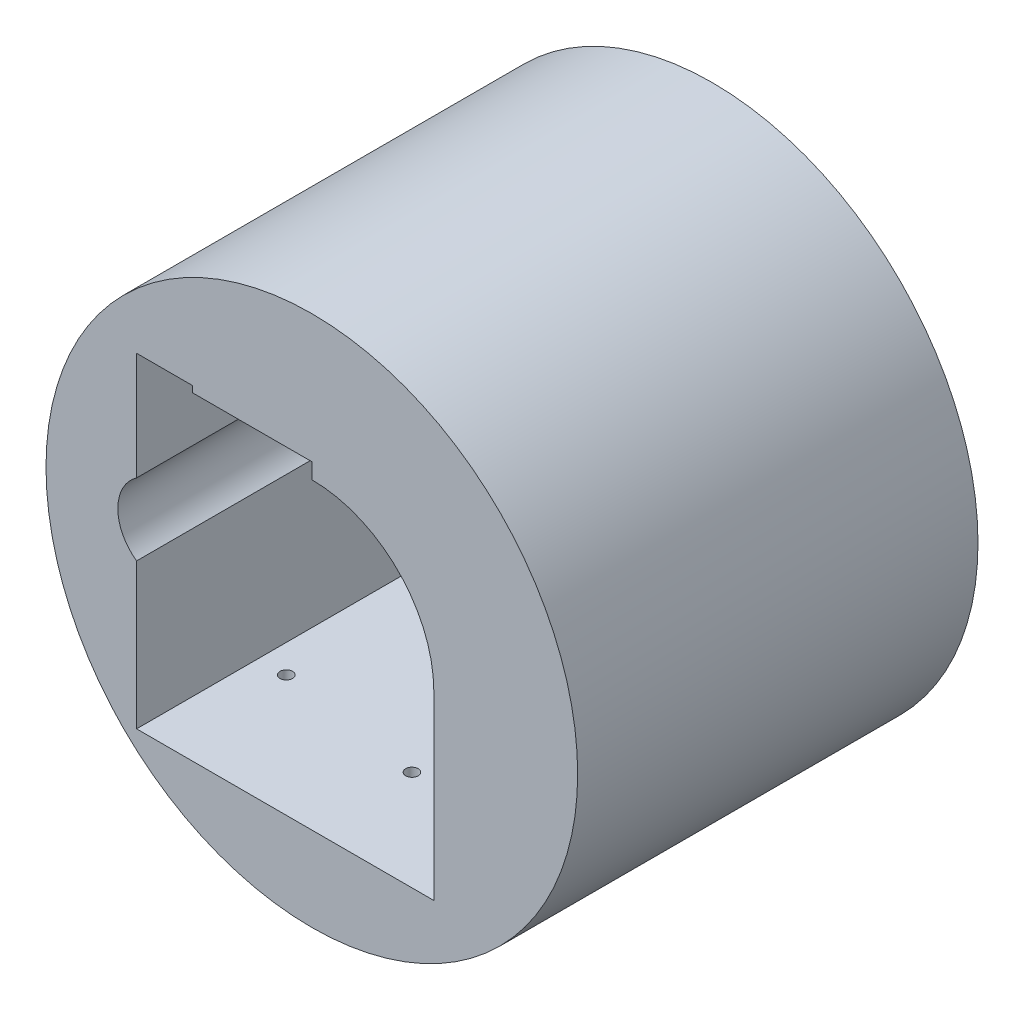
ISO-10303-21;
HEADER;
FILE_DESCRIPTION(('STEP AP214'),'2;1');
FILE_NAME('part.step','',(''),(''),'','','');
FILE_SCHEMA(('AUTOMOTIVE_DESIGN { 1 0 10303 214 1 1 1 1 }'));
ENDSEC;
DATA;
#1=APPLICATION_CONTEXT('core data for automotive mechanical design processes');
#2=APPLICATION_PROTOCOL_DEFINITION('international standard','automotive_design',2000,#1);
#3=PRODUCT_CONTEXT('',#1,'mechanical');
#4=PRODUCT('Part','Part','',(#3));
#5=PRODUCT_RELATED_PRODUCT_CATEGORY('part','',(#4));
#6=PRODUCT_DEFINITION_FORMATION('','',#4);
#7=PRODUCT_DEFINITION_CONTEXT('part definition',#1,'design');
#8=PRODUCT_DEFINITION('design','',#6,#7);
#9=PRODUCT_DEFINITION_SHAPE('','',#8);
#10=(LENGTH_UNIT() NAMED_UNIT(*) SI_UNIT(.MILLI.,.METRE.));
#11=(NAMED_UNIT(*) PLANE_ANGLE_UNIT() SI_UNIT($,.RADIAN.));
#12=(NAMED_UNIT(*) SI_UNIT($,.STERADIAN.) SOLID_ANGLE_UNIT());
#13=UNCERTAINTY_MEASURE_WITH_UNIT(LENGTH_MEASURE(1.E-05),#10,'distance_accuracy_value','');
#14=(GEOMETRIC_REPRESENTATION_CONTEXT(3) GLOBAL_UNCERTAINTY_ASSIGNED_CONTEXT((#13)) GLOBAL_UNIT_ASSIGNED_CONTEXT((#10,
#11,#12)) REPRESENTATION_CONTEXT('',''));
#15=CARTESIAN_POINT('',(0.,0.,0.));
#16=DIRECTION('',(0.,0.,1.));
#17=DIRECTION('',(1.,0.,0.));
#18=AXIS2_PLACEMENT_3D('',#15,#16,#17);
#19=CARTESIAN_POINT('',(18.3011411056539,-1.1715728752538,-4.55781586355207));
#20=DIRECTION('',(0.,-1.,0.));
#21=DIRECTION('',(0.,0.,-1.));
#22=AXIS2_PLACEMENT_3D('',#19,#20,#21);
#23=CYLINDRICAL_SURFACE('',#22,1.);
#24=CARTESIAN_POINT('',(18.3011411056539,-3.99999999999999,-4.55781586355207));
#25=DIRECTION('',(0.,-1.,0.));
#26=DIRECTION('',(0.,0.,-1.));
#27=AXIS2_PLACEMENT_3D('',#24,#25,#26);
#28=CIRCLE('',#27,1.);
#29=CARTESIAN_POINT('',(18.3011411056539,-3.99999999999999,-5.55781586355208));
#30=VERTEX_POINT('',#29);
#31=EDGE_CURVE('E165',#30,#30,#28,.F.);
#32=ORIENTED_EDGE('',*,*,#31,.T.);
#33=EDGE_LOOP('',(#32));
#34=FACE_BOUND('',#33,.T.);
#35=CARTESIAN_POINT('',(18.3011411056539,-5.49999999999673,-4.55781586355207));
#36=DIRECTION('',(0.,-1.,0.));
#37=DIRECTION('',(0.,0.,-1.));
#38=AXIS2_PLACEMENT_3D('',#35,#36,#37);
#39=CIRCLE('',#38,1.);
#40=CARTESIAN_POINT('',(18.3011411056539,-5.49999999999673,-5.55781586355208));
#41=VERTEX_POINT('',#40);
#42=EDGE_CURVE('E477',#41,#41,#39,.F.);
#43=ORIENTED_EDGE('',*,*,#42,.F.);
#44=EDGE_LOOP('',(#43));
#45=FACE_BOUND('',#44,.T.);
#46=ADVANCED_FACE('F33',(#34,#45),#23,.F.);
#47=CARTESIAN_POINT('',(18.3011411056539,-1.1715728752538,-32.5578158635521));
#48=DIRECTION('',(0.,-1.,0.));
#49=DIRECTION('',(0.,0.,-1.));
#50=AXIS2_PLACEMENT_3D('',#47,#48,#49);
#51=CYLINDRICAL_SURFACE('',#50,1.);
#52=CARTESIAN_POINT('',(18.3011411056539,-4.,-32.5578158635521));
#53=DIRECTION('',(0.,-1.,0.));
#54=DIRECTION('',(0.,0.,-1.));
#55=AXIS2_PLACEMENT_3D('',#52,#53,#54);
#56=CIRCLE('',#55,1.);
#57=CARTESIAN_POINT('',(18.3011411056539,-4.,-33.5578158635521));
#58=VERTEX_POINT('',#57);
#59=EDGE_CURVE('E162',#58,#58,#56,.F.);
#60=ORIENTED_EDGE('',*,*,#59,.T.);
#61=EDGE_LOOP('',(#60));
#62=FACE_BOUND('',#61,.T.);
#63=CARTESIAN_POINT('',(18.3011411056539,-5.49999999999673,-32.5578158635521));
#64=DIRECTION('',(0.,-1.,0.));
#65=DIRECTION('',(0.,0.,-1.));
#66=AXIS2_PLACEMENT_3D('',#63,#64,#65);
#67=CIRCLE('',#66,1.);
#68=CARTESIAN_POINT('',(18.3011411056539,-5.49999999999673,-33.5578158635521));
#69=VERTEX_POINT('',#68);
#70=EDGE_CURVE('E155',#69,#69,#67,.F.);
#71=ORIENTED_EDGE('',*,*,#70,.F.);
#72=EDGE_LOOP('',(#71));
#73=FACE_BOUND('',#72,.T.);
#74=ADVANCED_FACE('F241',(#62,#73),#51,.F.);
#75=CARTESIAN_POINT('',(41.8161335126856,-1.1715728752538,-1.12874839913922));
#76=DIRECTION('',(0.,-1.,0.));
#77=DIRECTION('',(0.,0.,-1.));
#78=AXIS2_PLACEMENT_3D('',#75,#76,#77);
#79=CYLINDRICAL_SURFACE('',#78,0.999999999999998);
#80=CARTESIAN_POINT('',(41.8161335126856,-3.99999999999999,-1.12874839913922));
#81=DIRECTION('',(0.,-1.,0.));
#82=DIRECTION('',(0.,0.,-1.));
#83=AXIS2_PLACEMENT_3D('',#80,#81,#82);
#84=CIRCLE('',#83,0.999999999999998);
#85=CARTESIAN_POINT('',(41.8161335126856,-3.99999999999999,-2.12874839913922));
#86=VERTEX_POINT('',#85);
#87=EDGE_CURVE('E166',#86,#86,#84,.F.);
#88=ORIENTED_EDGE('',*,*,#87,.T.);
#89=EDGE_LOOP('',(#88));
#90=FACE_BOUND('',#89,.T.);
#91=CARTESIAN_POINT('',(41.8161335126856,-12.4999999999967,-1.12874839913922));
#92=DIRECTION('',(0.,-1.,0.));
#93=DIRECTION('',(0.,0.,-1.));
#94=AXIS2_PLACEMENT_3D('',#91,#92,#93);
#95=CIRCLE('',#94,0.999999999999998);
#96=CARTESIAN_POINT('',(41.8161335126856,-12.4999999999967,-2.12874839913922));
#97=VERTEX_POINT('',#96);
#98=EDGE_CURVE('E161',#97,#97,#95,.F.);
#99=ORIENTED_EDGE('',*,*,#98,.F.);
#100=EDGE_LOOP('',(#99));
#101=FACE_BOUND('',#100,.T.);
#102=ADVANCED_FACE('F244',(#90,#101),#79,.F.);
#103=CARTESIAN_POINT('',(41.8161335126836,25.0000000000033,14.8712516008608));
#104=DIRECTION('',(0.,0.,-1.));
#105=DIRECTION('',(0.,1.,0.));
#106=AXIS2_PLACEMENT_3D('',#103,#104,#105);
#107=CYLINDRICAL_SURFACE('',#106,42.5);
#108=CARTESIAN_POINT('',(18.3011411056539,-10.4019085939883,-6.80781586355207));
#109=CARTESIAN_POINT('',(18.4605756897232,-10.5078069288308,-6.80781220830151));
#110=CARTESIAN_POINT('',(18.6210371329044,-10.6128214602459,-6.7908556810594));
#111=CARTESIAN_POINT('',(18.9382937431222,-10.8174561170813,-6.72182710057122));
#112=CARTESIAN_POINT('',(19.0950812110119,-10.9170654055825,-6.66968712876438));
#113=CARTESIAN_POINT('',(19.3621471241321,-11.0844456955812,-6.54603338011057));
#114=CARTESIAN_POINT('',(19.4746656871843,-11.1541807192807,-6.4820015275212));
#115=CARTESIAN_POINT('',(19.6897443591742,-11.2862064677296,-6.33302217933153));
#116=CARTESIAN_POINT('',(19.7923153781341,-11.3485053658054,-6.24809796764978));
#117=CARTESIAN_POINT('',(19.9840759330033,-11.4640084381692,-6.05736641909167));
#118=CARTESIAN_POINT('',(20.0731569975852,-11.5171393245457,-5.95140416495323));
#119=CARTESIAN_POINT('',(20.2321048978198,-11.6113135962962,-5.72116744144282));
#120=CARTESIAN_POINT('',(20.3019861918808,-11.6523660789854,-5.59690686056061));
#121=CARTESIAN_POINT('',(20.4099818389848,-11.715528869455,-5.35198855039096));
#122=CARTESIAN_POINT('',(20.4511206765045,-11.7394539982696,-5.23313137809204));
#123=CARTESIAN_POINT('',(20.5131175294567,-11.7754378044941,-4.98854735177319));
#124=CARTESIAN_POINT('',(20.5339935806353,-11.7875070348614,-4.86282671236489));
#125=CARTESIAN_POINT('',(20.5530297640251,-11.7985123298085,-4.62333607196803));
#126=CARTESIAN_POINT('',(20.5534679028538,-11.7987654223653,-4.50980077695234));
#127=CARTESIAN_POINT('',(20.5373182659976,-11.7894293279362,-4.28437764352726));
#128=CARTESIAN_POINT('',(20.5207345833194,-11.7798425070209,-4.17248941563055));
#129=CARTESIAN_POINT('',(20.4720875945635,-11.7516320102377,-3.95664966032859));
#130=CARTESIAN_POINT('',(20.4404631857588,-11.7332644866352,-3.8525644168585));
#131=CARTESIAN_POINT('',(20.3633758627356,-11.6882974488643,-3.65157106581906));
#132=CARTESIAN_POINT('',(20.3179109095621,-11.6616967217909,-3.5546640183409));
#133=CARTESIAN_POINT('',(20.2122467330221,-11.5995356940574,-3.36510203923708));
#134=CARTESIAN_POINT('',(20.1513948739883,-11.5635756101614,-3.27294384779255));
#135=CARTESIAN_POINT('',(20.0187136753197,-11.4846329962385,-3.10031386531784));
#136=CARTESIAN_POINT('',(19.9468802422592,-11.4416478471762,-3.01984645397763));
#137=CARTESIAN_POINT('',(19.7859815401766,-11.3446304857722,-2.86319917536076));
#138=CARTESIAN_POINT('',(19.6958872449045,-11.2899000343261,-2.78851164050748));
#139=CARTESIAN_POINT('',(19.5078603950721,-11.1746200099008,-2.65528435466808));
#140=CARTESIAN_POINT('',(19.4099238726314,-11.1140674880165,-2.59675284549644));
#141=CARTESIAN_POINT('',(19.1941969202485,-10.9793880382003,-2.48863013463941));
#142=CARTESIAN_POINT('',(19.0755823436275,-10.9045638692927,-2.44155235968801));
#143=CARTESIAN_POINT('',(18.8346302184091,-10.7508178943699,-2.36834850983783));
#144=CARTESIAN_POINT('',(18.712290829184,-10.6718940484253,-2.34223297380467));
#145=CARTESIAN_POINT('',(18.4494080733579,-10.500338632118,-2.30827266296366));
#146=CARTESIAN_POINT('',(18.3087092705993,-10.4073324156304,-2.3034901033834));
#147=CARTESIAN_POINT('',(18.0294056815479,-10.2203050909705,-2.31990212727429));
#148=CARTESIAN_POINT('',(17.8908028031475,-10.1262831776893,-2.34111908774265));
#149=CARTESIAN_POINT('',(17.6078487445364,-9.9319443037692,-2.41192944706449));
#150=CARTESIAN_POINT('',(17.4639572328008,-9.83174284946365,-2.46370567736356));
#151=CARTESIAN_POINT('',(17.1869032333797,-9.63639237511369,-2.5970582066671));
#152=CARTESIAN_POINT('',(17.0537323471767,-9.54123942040729,-2.67861089604462));
#153=CARTESIAN_POINT('',(16.8320934441719,-9.38112840781303,-2.84924012722681));
#154=CARTESIAN_POINT('',(16.7403756938218,-9.31424859958704,-2.93230707363389));
#155=CARTESIAN_POINT('',(16.569487421053,-9.18871239318988,-3.11575613536224));
#156=CARTESIAN_POINT('',(16.4902992995643,-9.13004447424469,-3.21611354286206));
#157=CARTESIAN_POINT('',(16.360589630629,-9.03337580658109,-3.41404781696955));
#158=CARTESIAN_POINT('',(16.3074763778957,-8.99355498327169,-3.50903121619044));
#159=CARTESIAN_POINT('',(16.2146126733032,-8.92367189945809,-3.70870067237782));
#160=CARTESIAN_POINT('',(16.1748560469611,-8.89360513008472,-3.81338221746706));
#161=CARTESIAN_POINT('',(16.110786157732,-8.84504056011061,-4.03078599994615));
#162=CARTESIAN_POINT('',(16.0865760933446,-8.82662008008442,-4.14355655426096));
#163=CARTESIAN_POINT('',(16.0557834493203,-8.80317680998289,-4.37283413412612));
#164=CARTESIAN_POINT('',(16.04918959552,-8.7981454510388,-4.48933872159499));
#165=CARTESIAN_POINT('',(16.0538255120867,-8.80167853261571,-4.70852745465439));
#166=CARTESIAN_POINT('',(16.063123889897,-8.80876973384415,-4.81128449793671));
#167=CARTESIAN_POINT('',(16.0953615233085,-8.83330154280663,-5.01333948404408));
#168=CARTESIAN_POINT('',(16.1183009213851,-8.85074225863759,-5.11263739072824));
#169=CARTESIAN_POINT('',(16.176556333294,-8.8948875489511,-5.30533463351144));
#170=CARTESIAN_POINT('',(16.2118757435383,-8.92159466561709,-5.3987323426051));
#171=CARTESIAN_POINT('',(16.2932606807871,-8.98287143567977,-5.5779196444827));
#172=CARTESIAN_POINT('',(16.339330009213,-9.01744387032746,-5.66370653105662));
#173=CARTESIAN_POINT('',(16.4470821710994,-9.09789293157709,-5.83714831436912));
#174=CARTESIAN_POINT('',(16.510013026032,-9.14465281096455,-5.92361377668957));
#175=CARTESIAN_POINT('',(16.6452258776938,-9.24445181846824,-6.08474891792535));
#176=CARTESIAN_POINT('',(16.7175123427331,-9.29749394599945,-6.15941292228042));
#177=CARTESIAN_POINT('',(16.8841897193127,-9.41890064557258,-6.30985941392261));
#178=CARTESIAN_POINT('',(16.9801585514822,-9.48825056452142,-6.38309760057786));
#179=CARTESIAN_POINT('',(17.1801595322881,-9.63140125762806,-6.51232396802367));
#180=CARTESIAN_POINT('',(17.2842016820515,-9.7052075263238,-6.56829031155798));
#181=CARTESIAN_POINT('',(17.5180075596621,-9.86940018043223,-6.67168521200516));
#182=CARTESIAN_POINT('',(17.648957060931,-9.96031790548546,-6.71559179619434));
#183=CARTESIAN_POINT('',(17.9156521961799,-10.143178990135,-6.7787652038681));
#184=CARTESIAN_POINT('',(18.0513873532905,-10.2351198403064,-6.79808278748166));
#185=CARTESIAN_POINT('',(18.2255944987443,-10.351641617088,-6.80686455582957));
#186=CARTESIAN_POINT('',(18.2633389386859,-10.3767999479646,-6.80781673021719));
#187=CARTESIAN_POINT('',(18.3011411056539,-10.4019085939883,-6.80781586355207));
#188=B_SPLINE_CURVE_WITH_KNOTS('',3,(#108,#109,#110,#111,#112,#113,#114,#115,#116,#117,#118,
#119,#120,#121,#122,#123,#124,#125,#126,#127,#128,#129,#130,#131,#132,#133,#134,#135,#136,#137,
#138,#139,#140,#141,#142,#143,#144,#145,#146,#147,#148,#149,#150,#151,#152,#153,#154,#155,#156,
#157,#158,#159,#160,#161,#162,#163,#164,#165,#166,#167,#168,#169,#170,#171,#172,#173,#174,#175,
#176,#177,#178,#179,#180,#181,#182,#183,#184,#185,#186,#187),.UNSPECIFIED.,.T.,.F.,(4,2,2,2,2,2,
2,2,2,2,2,2,2,2,2,2,2,2,2,2,2,2,2,2,2,2,2,2,2,2,2,2,2,2,2,2,2,2,2,4),(0.,0.574052362161319,
1.14921606442613,1.58856636672258,2.0274292267574,2.46965233083123,2.91154149981678,
3.29344769929199,3.6750136544939,4.01393529952513,4.35277546775038,4.6822837602136,
5.01184061853809,5.35884506284503,5.70597917126234,6.09203497644143,6.4782873611793,
6.9203442482344,7.36262324253802,7.866690631641,8.37119216110588,8.91703498191525,
9.46244594282981,9.8828371697841,10.3026325721155,10.6488779596504,10.9949630643858,
11.34332237119,11.6914586787505,12.00022318568,12.3089909175999,12.6178434252272,
12.9268053162495,13.2756663839667,13.6246946895073,14.0408204318046,14.457470157811,
14.9515845510078,15.4446772595659,15.580785892266),.UNSPECIFIED.);
#189=CARTESIAN_POINT('',(18.3011411056539,-10.4019085939883,-6.80781586355207));
#190=VERTEX_POINT('',#189);
#191=EDGE_CURVE('E38',#190,#190,#188,.T.);
#192=ORIENTED_EDGE('',*,*,#191,.F.);
#193=EDGE_LOOP('',(#192));
#194=FACE_BOUND('',#193,.T.);
#195=CARTESIAN_POINT('',(18.3011411056539,-10.4019085939883,-34.8078158635521));
#196=CARTESIAN_POINT('',(18.4605756897232,-10.5078069288308,-34.8078122083015));
#197=CARTESIAN_POINT('',(18.6210371329044,-10.6128214602459,-34.7908556810594));
#198=CARTESIAN_POINT('',(18.9382937431222,-10.8174561170813,-34.7218271005712));
#199=CARTESIAN_POINT('',(19.0950812110119,-10.9170654055825,-34.6696871287644));
#200=CARTESIAN_POINT('',(19.3621471241321,-11.0844456955813,-34.5460333801106));
#201=CARTESIAN_POINT('',(19.4746656871843,-11.1541807192807,-34.4820015275212));
#202=CARTESIAN_POINT('',(19.6897443591742,-11.2862064677296,-34.3330221793315));
#203=CARTESIAN_POINT('',(19.7923153781341,-11.3485053658054,-34.2480979676498));
#204=CARTESIAN_POINT('',(19.9840759330033,-11.4640084381692,-34.0573664190917));
#205=CARTESIAN_POINT('',(20.0731569975852,-11.5171393245457,-33.9514041649532));
#206=CARTESIAN_POINT('',(20.2321048978198,-11.6113135962962,-33.7211674414428));
#207=CARTESIAN_POINT('',(20.3019861918808,-11.6523660789854,-33.5969068605606));
#208=CARTESIAN_POINT('',(20.4099818389848,-11.715528869455,-33.351988550391));
#209=CARTESIAN_POINT('',(20.4511206765045,-11.7394539982696,-33.233131378092));
#210=CARTESIAN_POINT('',(20.5131175294567,-11.7754378044942,-32.9885473517732));
#211=CARTESIAN_POINT('',(20.5339935806353,-11.7875070348614,-32.8628267123649));
#212=CARTESIAN_POINT('',(20.5530297640251,-11.7985123298085,-32.623336071968));
#213=CARTESIAN_POINT('',(20.5534679028538,-11.7987654223653,-32.5098007769523));
#214=CARTESIAN_POINT('',(20.5373182659976,-11.7894293279362,-32.2843776435273));
#215=CARTESIAN_POINT('',(20.5207345833194,-11.7798425070209,-32.1724894156306));
#216=CARTESIAN_POINT('',(20.4720875945635,-11.7516320102377,-31.9566496603286));
#217=CARTESIAN_POINT('',(20.4404631857588,-11.7332644866352,-31.8525644168585));
#218=CARTESIAN_POINT('',(20.3633758627356,-11.6882974488643,-31.6515710658191));
#219=CARTESIAN_POINT('',(20.3179109095621,-11.6616967217909,-31.5546640183409));
#220=CARTESIAN_POINT('',(20.2122467330221,-11.5995356940574,-31.3651020392371));
#221=CARTESIAN_POINT('',(20.1513948739883,-11.5635756101614,-31.2729438477926));
#222=CARTESIAN_POINT('',(20.0187136753197,-11.4846329962385,-31.1003138653178));
#223=CARTESIAN_POINT('',(19.9468802422592,-11.4416478471762,-31.0198464539776));
#224=CARTESIAN_POINT('',(19.7859815401766,-11.3446304857722,-30.8631991753608));
#225=CARTESIAN_POINT('',(19.6958872449045,-11.2899000343261,-30.7885116405075));
#226=CARTESIAN_POINT('',(19.5078603950721,-11.1746200099009,-30.6552843546681));
#227=CARTESIAN_POINT('',(19.4099238726314,-11.1140674880166,-30.5967528454964));
#228=CARTESIAN_POINT('',(19.1941969202485,-10.9793880382003,-30.4886301346394));
#229=CARTESIAN_POINT('',(19.0755823436275,-10.9045638692927,-30.441552359688));
#230=CARTESIAN_POINT('',(18.8346302184091,-10.7508178943699,-30.3683485098378));
#231=CARTESIAN_POINT('',(18.712290829184,-10.6718940484253,-30.3422329738047));
#232=CARTESIAN_POINT('',(18.4494080733579,-10.500338632118,-30.3082726629637));
#233=CARTESIAN_POINT('',(18.3087092705993,-10.4073324156304,-30.3034901033834));
#234=CARTESIAN_POINT('',(18.0294056815479,-10.2203050909705,-30.3199021272743));
#235=CARTESIAN_POINT('',(17.8908028031475,-10.1262831776893,-30.3411190877427));
#236=CARTESIAN_POINT('',(17.6078487445364,-9.9319443037692,-30.4119294470645));
#237=CARTESIAN_POINT('',(17.4639572328008,-9.83174284946365,-30.4637056773636));
#238=CARTESIAN_POINT('',(17.1869032333797,-9.63639237511369,-30.5970582066671));
#239=CARTESIAN_POINT('',(17.0537323471767,-9.54123942040729,-30.6786108960446));
#240=CARTESIAN_POINT('',(16.8320934441719,-9.38112840781303,-30.8492401272268));
#241=CARTESIAN_POINT('',(16.7403756938218,-9.31424859958704,-30.9323070736339));
#242=CARTESIAN_POINT('',(16.569487421053,-9.18871239318988,-31.1157561353623));
#243=CARTESIAN_POINT('',(16.4902992995643,-9.13004447424469,-31.2161135428621));
#244=CARTESIAN_POINT('',(16.360589630629,-9.03337580658109,-31.4140478169696));
#245=CARTESIAN_POINT('',(16.3074763778956,-8.99355498327169,-31.5090312161905));
#246=CARTESIAN_POINT('',(16.2146126733032,-8.92367189945809,-31.7087006723778));
#247=CARTESIAN_POINT('',(16.1748560469611,-8.89360513008472,-31.8133822174671));
#248=CARTESIAN_POINT('',(16.110786157732,-8.8450405601106,-32.0307859999462));
#249=CARTESIAN_POINT('',(16.0865760933445,-8.82662008008441,-32.143556554261));
#250=CARTESIAN_POINT('',(16.0557834493203,-8.80317680998289,-32.3728341341261));
#251=CARTESIAN_POINT('',(16.04918959552,-8.79814545103881,-32.489338721595));
#252=CARTESIAN_POINT('',(16.0538255120867,-8.80167853261572,-32.7085274546544));
#253=CARTESIAN_POINT('',(16.063123889897,-8.80876973384416,-32.8112844979367));
#254=CARTESIAN_POINT('',(16.0953615233085,-8.83330154280663,-33.0133394840441));
#255=CARTESIAN_POINT('',(16.1183009213851,-8.8507422586376,-33.1126373907282));
#256=CARTESIAN_POINT('',(16.176556333294,-8.89488754895111,-33.3053346335114));
#257=CARTESIAN_POINT('',(16.2118757435383,-8.9215946656171,-33.3987323426051));
#258=CARTESIAN_POINT('',(16.2932606807871,-8.98287143567977,-33.5779196444827));
#259=CARTESIAN_POINT('',(16.339330009213,-9.01744387032747,-33.6637065310566));
#260=CARTESIAN_POINT('',(16.4470821710994,-9.09789293157711,-33.8371483143691));
#261=CARTESIAN_POINT('',(16.510013026032,-9.14465281096455,-33.9236137766896));
#262=CARTESIAN_POINT('',(16.6452258776938,-9.24445181846824,-34.0847489179254));
#263=CARTESIAN_POINT('',(16.7175123427331,-9.29749394599945,-34.1594129222804));
#264=CARTESIAN_POINT('',(16.8841897193127,-9.41890064557258,-34.3098594139226));
#265=CARTESIAN_POINT('',(16.9801585514822,-9.48825056452143,-34.3830976005779));
#266=CARTESIAN_POINT('',(17.1801595322881,-9.63140125762807,-34.5123239680237));
#267=CARTESIAN_POINT('',(17.2842016820515,-9.7052075263238,-34.568290311558));
#268=CARTESIAN_POINT('',(17.5180075596622,-9.86940018043223,-34.6716852120052));
#269=CARTESIAN_POINT('',(17.648957060931,-9.96031790548547,-34.7155917961944));
#270=CARTESIAN_POINT('',(17.9156521961799,-10.143178990135,-34.7787652038681));
#271=CARTESIAN_POINT('',(18.0513873532905,-10.2351198403064,-34.7980827874817));
#272=CARTESIAN_POINT('',(18.2255944987443,-10.351641617088,-34.8068645558296));
#273=CARTESIAN_POINT('',(18.2633389386859,-10.3767999479646,-34.8078167302172));
#274=CARTESIAN_POINT('',(18.3011411056539,-10.4019085939883,-34.8078158635521));
#275=B_SPLINE_CURVE_WITH_KNOTS('',3,(#195,#196,#197,#198,#199,#200,#201,#202,#203,#204,#205,
#206,#207,#208,#209,#210,#211,#212,#213,#214,#215,#216,#217,#218,#219,#220,#221,#222,#223,#224,
#225,#226,#227,#228,#229,#230,#231,#232,#233,#234,#235,#236,#237,#238,#239,#240,#241,#242,#243,
#244,#245,#246,#247,#248,#249,#250,#251,#252,#253,#254,#255,#256,#257,#258,#259,#260,#261,#262,
#263,#264,#265,#266,#267,#268,#269,#270,#271,#272,#273,#274),.UNSPECIFIED.,.T.,.F.,(4,2,2,2,2,2,
2,2,2,2,2,2,2,2,2,2,2,2,2,2,2,2,2,2,2,2,2,2,2,2,2,2,2,2,2,2,2,2,2,4),(0.,0.574052362161317,
1.14921606442613,1.58856636672259,2.02742922675741,2.46965233083124,2.91154149981679,
3.293447699292,3.6750136544939,4.01393529952514,4.3527754677504,4.68228376021363,
5.01184061853811,5.35884506284505,5.70597917126236,6.09203497644144,6.47828736117932,
6.92034424823443,7.36262324253804,7.86669063164103,8.37119216110591,8.91703498191528,
9.46244594282984,9.88283716978413,10.3026325721155,10.6488779596504,10.9949630643858,
11.3433223711901,11.6914586787506,12.00022318568,12.3089909175999,12.6178434252272,
12.9268053162495,13.2756663839668,13.6246946895074,14.0408204318046,14.457470157811,
14.9515845510079,15.4446772595659,15.5807858922661),.UNSPECIFIED.);
#276=CARTESIAN_POINT('',(18.3011411056539,-10.4019085939883,-34.8078158635521));
#277=VERTEX_POINT('',#276);
#278=EDGE_CURVE('E302',#277,#277,#275,.T.);
#279=ORIENTED_EDGE('',*,*,#278,.F.);
#280=EDGE_LOOP('',(#279));
#281=FACE_BOUND('',#280,.T.);
#282=CARTESIAN_POINT('',(41.8161335126836,-17.4999999999967,-3.37874839913922));
#283=CARTESIAN_POINT('',(41.9424220888927,-17.4999992042486,-3.37874282915832));
#284=CARTESIAN_POINT('',(42.068799981149,-17.499431074244,-3.36808014842739));
#285=CARTESIAN_POINT('',(42.3180687451767,-17.4972193090463,-3.32569620991315));
#286=CARTESIAN_POINT('',(42.4409553420096,-17.4955744100082,-3.29395020518664));
#287=CARTESIAN_POINT('',(42.6795945906514,-17.49139526175,-3.21031171483013));
#288=CARTESIAN_POINT('',(42.7953508703286,-17.4888614692622,-3.15842957412344));
#289=CARTESIAN_POINT('',(43.0164803642576,-17.4831898173157,-3.03600764248508));
#290=CARTESIAN_POINT('',(43.1218560058386,-17.4800520995834,-2.96547222757409));
#291=CARTESIAN_POINT('',(43.3193816437007,-17.473521598497,-2.80765880168756));
#292=CARTESIAN_POINT('',(43.4115186068705,-17.4701285687335,-2.72036448683642));
#293=CARTESIAN_POINT('',(43.5798402864828,-17.4634719780592,-2.5315440771329));
#294=CARTESIAN_POINT('',(43.6560243481079,-17.4602084224674,-2.43001739837129));
#295=CARTESIAN_POINT('',(43.7903147694006,-17.4541770142549,-2.21554432383161));
#296=CARTESIAN_POINT('',(43.8484107681249,-17.4514094461223,-2.10259143194897));
#297=CARTESIAN_POINT('',(43.9448095122216,-17.4466851616327,-1.86851792753297));
#298=CARTESIAN_POINT('',(43.9831124212553,-17.4447284385712,-1.74739738254413));
#299=CARTESIAN_POINT('',(44.0388027804166,-17.4418487622563,-1.50054825473719));
#300=CARTESIAN_POINT('',(44.056209993068,-17.4409248322752,-1.37482414201688));
#301=CARTESIAN_POINT('',(44.0696758150133,-17.4402120018956,-1.12223524866468));
#302=CARTESIAN_POINT('',(44.0657346085532,-17.4404230917014,-0.995370477886593));
#303=CARTESIAN_POINT('',(44.0366319146825,-17.4419555889636,-0.744235892839721));
#304=CARTESIAN_POINT('',(44.0114917864937,-17.4432758788275,-0.619963595595412));
#305=CARTESIAN_POINT('',(43.9407379917633,-17.4468762110066,-0.377405505312395));
#306=CARTESIAN_POINT('',(43.8951242309023,-17.4491562577433,-0.259119739855683));
#307=CARTESIAN_POINT('',(43.7846936159658,-17.4544204179865,-0.0318236389575769));
#308=CARTESIAN_POINT('',(43.719867034478,-17.4574048879849,0.0771819618813105));
#309=CARTESIAN_POINT('',(43.5728580442851,-17.463741164417,0.282771686240818));
#310=CARTESIAN_POINT('',(43.4906754974438,-17.4670929737743,0.379355710888307));
#311=CARTESIAN_POINT('',(43.3111669544483,-17.4737911255746,0.557484924372756));
#312=CARTESIAN_POINT('',(43.2138224644393,-17.4771374562299,0.639011477758691));
#313=CARTESIAN_POINT('',(43.0068182476987,-17.4834435308626,0.784567878792195));
#314=CARTESIAN_POINT('',(42.8971585176927,-17.4864032747373,0.848597721787619));
#315=CARTESIAN_POINT('',(42.6686256693997,-17.4916027702576,0.957341388784478));
#316=CARTESIAN_POINT('',(42.5497522353965,-17.4938424972176,1.00205455053627));
#317=CARTESIAN_POINT('',(42.3061712403794,-17.4973491928175,1.07088337432662));
#318=CARTESIAN_POINT('',(42.181463728314,-17.4986161696173,1.09499920914593));
#319=CARTESIAN_POINT('',(41.929916325495,-17.5000335298768,1.12192582441762));
#320=CARTESIAN_POINT('',(41.8030792009474,-17.5001852641346,1.12476237873242));
#321=CARTESIAN_POINT('',(41.5507308126412,-17.4993586269449,1.10911719249881));
#322=CARTESIAN_POINT('',(41.4252195439587,-17.4983802596957,1.09063553114781));
#323=CARTESIAN_POINT('',(41.1791579761622,-17.4954044728283,1.03289987427651));
#324=CARTESIAN_POINT('',(41.0586049052942,-17.4934076311654,0.993657659309481));
#325=CARTESIAN_POINT('',(40.8257963730031,-17.4886196765712,0.895526785310962));
#326=CARTESIAN_POINT('',(40.7135409651708,-17.4858285585108,0.836637999404876));
#327=CARTESIAN_POINT('',(40.5003960011277,-17.4797625932495,0.700819713255916));
#328=CARTESIAN_POINT('',(40.3995174587582,-17.4764872842755,0.62387294948548));
#329=CARTESIAN_POINT('',(40.212100566677,-17.4698232867481,0.454148145935562));
#330=CARTESIAN_POINT('',(40.1255623195219,-17.4664345973842,0.361369992945353));
#331=CARTESIAN_POINT('',(39.9691956328318,-17.4599219098898,0.162505095752567));
#332=CARTESIAN_POINT('',(39.8993838788221,-17.4567981780573,0.0564052218843718));
#333=CARTESIAN_POINT('',(39.7785659363644,-17.4511718566729,-0.166025068091379));
#334=CARTESIAN_POINT('',(39.72755965868,-17.4486692641734,-0.282355435649636));
#335=CARTESIAN_POINT('',(39.6458296009704,-17.4445693368099,-0.521882892448666));
#336=CARTESIAN_POINT('',(39.615095213134,-17.4429715285551,-0.645076353732022));
#337=CARTESIAN_POINT('',(39.5747466879876,-17.4408600239868,-0.894883675147225));
#338=CARTESIAN_POINT('',(39.5651324115073,-17.4403463205295,-1.02149751273505));
#339=CARTESIAN_POINT('',(39.5672983361126,-17.4404611301174,-1.27438544326094));
#340=CARTESIAN_POINT('',(39.579052292594,-17.4410882420062,-1.40065976245581));
#341=CARTESIAN_POINT('',(39.6235667446075,-17.4434110421477,-1.64943952188014));
#342=CARTESIAN_POINT('',(39.6563272797938,-17.4451067324174,-1.77194495499458));
#343=CARTESIAN_POINT('',(39.7419194366943,-17.4493752556527,-2.00971457211845));
#344=CARTESIAN_POINT('',(39.7947511529481,-17.4519480927498,-2.12497872201685));
#345=CARTESIAN_POINT('',(39.9189817135873,-17.4576808669418,-2.3450031148671));
#346=CARTESIAN_POINT('',(39.9903800074493,-17.4608407866281,-2.4497636691367));
#347=CARTESIAN_POINT('',(40.1498118988892,-17.4673960450045,-2.64593879199569));
#348=CARTESIAN_POINT('',(40.2378639947549,-17.4707916427945,-2.73733831768215));
#349=CARTESIAN_POINT('',(40.4280879889037,-17.477433618614,-2.90408742090179));
#350=CARTESIAN_POINT('',(40.5302633513431,-17.4806799597726,-2.97943304917472));
#351=CARTESIAN_POINT('',(40.7459214157898,-17.4866600973792,-3.1119751230225));
#352=CARTESIAN_POINT('',(40.8594155196746,-17.4893933688378,-3.16915301977114));
#353=CARTESIAN_POINT('',(41.094322818777,-17.4940317303205,-3.26357329439573));
#354=CARTESIAN_POINT('',(41.2157264867044,-17.4959377962753,-3.30083917638576));
#355=CARTESIAN_POINT('',(41.417590570337,-17.4982038239622,-3.3446218384285));
#356=CARTESIAN_POINT('',(41.4967440358934,-17.4988744226554,-3.35740291523868));
#357=CARTESIAN_POINT('',(41.6559641947432,-17.4997727628237,-3.37446795796832));
#358=CARTESIAN_POINT('',(41.7360308871561,-17.5000005047258,-3.37875193208026));
#359=CARTESIAN_POINT('',(41.8161335126836,-17.4999999999967,-3.37874839913922));
#360=B_SPLINE_CURVE_WITH_KNOTS('',3,(#282,#283,#284,#285,#286,#287,#288,#289,#290,#291,#292,
#293,#294,#295,#296,#297,#298,#299,#300,#301,#302,#303,#304,#305,#306,#307,#308,#309,#310,#311,
#312,#313,#314,#315,#316,#317,#318,#319,#320,#321,#322,#323,#324,#325,#326,#327,#328,#329,#330,
#331,#332,#333,#334,#335,#336,#337,#338,#339,#340,#341,#342,#343,#344,#345,#346,#347,#348,#349,
#350,#351,#352,#353,#354,#355,#356,#357,#358,#359),.UNSPECIFIED.,.T.,.F.,(4,2,2,2,2,2,2,2,2,2,2,
2,2,2,2,2,2,2,2,2,2,2,2,2,2,2,2,2,2,2,2,2,2,2,2,2,2,2,4),(0.,0.378573320387888,
0.757591785455974,1.13641578730422,1.51515099651962,1.8942565422278,2.2733776460014,
2.65271551462215,3.0320502465949,3.41102593176282,3.78999834621422,4.1685893781952,
4.54718215431553,4.92596693960279,5.30475473975061,5.6840082396423,6.06326184037244,
6.44252844233351,6.8217918627839,7.20059583800547,7.57939840597072,7.95798625303172,
8.33657654500338,8.71553025649174,9.09448667800275,9.47381956835437,9.85315065866074,
10.2322830959724,10.6114130349953,10.9900776386882,11.3687429571905,11.7474100593124,
12.12606593474,12.5051449006218,12.8843170125727,13.2638750155749,13.6429839935025,
13.8831066321898,14.1232290393622),.UNSPECIFIED.);
#361=CARTESIAN_POINT('',(41.8161335126836,-17.4999999999967,-3.37874839913922));
#362=VERTEX_POINT('',#361);
#363=EDGE_CURVE('E11',#362,#362,#360,.T.);
#364=ORIENTED_EDGE('',*,*,#363,.F.);
#365=EDGE_LOOP('',(#364));
#366=FACE_BOUND('',#365,.T.);
#367=CARTESIAN_POINT('',(41.8161335126836,25.0000000000033,14.8712516008608));
#368=DIRECTION('',(0.,0.,-1.));
#369=DIRECTION('',(0.,1.,0.));
#370=AXIS2_PLACEMENT_3D('',#367,#368,#369);
#371=CIRCLE('',#370,42.5);
#372=CARTESIAN_POINT('',(41.8161335126836,67.5000000000033,14.8712516008608));
#373=VERTEX_POINT('',#372);
#374=EDGE_CURVE('E47',#373,#373,#371,.T.);
#375=ORIENTED_EDGE('',*,*,#374,.T.);
#376=EDGE_LOOP('',(#375));
#377=FACE_BOUND('',#376,.T.);
#378=CARTESIAN_POINT('',(41.8161335126836,25.0000000000033,-49.1287483991392));
#379=DIRECTION('',(0.,0.,-1.));
#380=DIRECTION('',(0.,1.,0.));
#381=AXIS2_PLACEMENT_3D('',#378,#379,#380);
#382=CIRCLE('',#381,42.5);
#383=CARTESIAN_POINT('',(41.8161335126836,67.5000000000033,-49.1287483991392));
#384=VERTEX_POINT('',#383);
#385=EDGE_CURVE('E208',#384,#384,#382,.T.);
#386=ORIENTED_EDGE('',*,*,#385,.F.);
#387=EDGE_LOOP('',(#386));
#388=FACE_BOUND('',#387,.T.);
#389=ADVANCED_FACE('F35',(#194,#281,#366,#377,#388),#107,.T.);
#390=CARTESIAN_POINT('',(41.8161335126836,25.0000000000033,14.8712516008608));
#391=DIRECTION('',(0.,0.,-1.));
#392=DIRECTION('',(0.,1.,0.));
#393=AXIS2_PLACEMENT_3D('',#390,#391,#392);
#394=PLANE('',#393);
#395=DIRECTION('',(1.,0.,0.));
#396=VECTOR('',#395,1.);
#397=CARTESIAN_POINT('',(13.8011411056539,48.0000017811583,14.8712516008608));
#398=LINE('',#397,#396);
#399=CARTESIAN_POINT('',(13.8011411056539,48.0000017811583,14.8712516008608));
#400=VERTEX_POINT('',#399);
#401=CARTESIAN_POINT('',(22.7486595847854,48.0000017811583,14.8712516008608));
#402=VERTEX_POINT('',#401);
#403=EDGE_CURVE('E122',#400,#402,#398,.T.);
#404=ORIENTED_EDGE('',*,*,#403,.T.);
#405=DIRECTION('',(0.,-1.,0.));
#406=VECTOR('',#405,1.);
#407=CARTESIAN_POINT('',(22.7486595847854,47.0000017811583,14.8712516008608));
#408=LINE('',#407,#406);
#409=CARTESIAN_POINT('',(22.7486595847854,47.0000017811583,14.8712516008608));
#410=VERTEX_POINT('',#409);
#411=EDGE_CURVE('E136',#402,#410,#408,.T.);
#412=ORIENTED_EDGE('',*,*,#411,.T.);
#413=DIRECTION('',(1.,0.,0.));
#414=VECTOR('',#413,1.);
#415=CARTESIAN_POINT('',(41.8161335126838,47.0000017811583,14.8712516008608));
#416=LINE('',#415,#414);
#417=CARTESIAN_POINT('',(41.8161335126838,47.0000017811583,14.8712516008608));
#418=VERTEX_POINT('',#417);
#419=EDGE_CURVE('E125',#410,#418,#416,.T.);
#420=ORIENTED_EDGE('',*,*,#419,.T.);
#421=DIRECTION('',(0.,-1.,0.));
#422=VECTOR('',#421,1.);
#423=CARTESIAN_POINT('',(41.8161335126836,44.5,14.8712516008608));
#424=LINE('',#423,#422);
#425=CARTESIAN_POINT('',(41.8161335126836,44.5,14.8712516008608));
#426=VERTEX_POINT('',#425);
#427=EDGE_CURVE('E177',#418,#426,#424,.T.);
#428=ORIENTED_EDGE('',*,*,#427,.T.);
#429=CARTESIAN_POINT('',(41.8161335126856,25.,14.8712516008608));
#430=DIRECTION('',(0.,0.,-1.));
#431=DIRECTION('',(0.,1.,0.));
#432=AXIS2_PLACEMENT_3D('',#429,#430,#431);
#433=CIRCLE('',#432,19.5);
#434=CARTESIAN_POINT('',(61.3161335126856,25.,14.8712516008608));
#435=VERTEX_POINT('',#434);
#436=EDGE_CURVE('E180',#426,#435,#433,.T.);
#437=ORIENTED_EDGE('',*,*,#436,.T.);
#438=DIRECTION('',(0.,-1.,0.));
#439=VECTOR('',#438,1.);
#440=CARTESIAN_POINT('',(61.3161335126856,-3.99999999999999,14.8712516008608));
#441=LINE('',#440,#439);
#442=CARTESIAN_POINT('',(61.3161335126856,-3.99999999999999,14.8712516008608));
#443=VERTEX_POINT('',#442);
#444=EDGE_CURVE('E183',#435,#443,#441,.T.);
#445=ORIENTED_EDGE('',*,*,#444,.T.);
#446=DIRECTION('',(-1.,0.,0.));
#447=VECTOR('',#446,1.);
#448=CARTESIAN_POINT('',(13.8011411056539,-3.99999999999999,14.8712516008608));
#449=LINE('',#448,#447);
#450=CARTESIAN_POINT('',(13.8011411056539,-3.99999999999999,14.8712516008608));
#451=VERTEX_POINT('',#450);
#452=EDGE_CURVE('E186',#443,#451,#449,.T.);
#453=ORIENTED_EDGE('',*,*,#452,.T.);
#454=DIRECTION('',(0.,1.,0.));
#455=VECTOR('',#454,1.);
#456=CARTESIAN_POINT('',(13.8011411056539,15.8348486100903,14.8712516008608));
#457=LINE('',#456,#455);
#458=CARTESIAN_POINT('',(13.8011411056539,19.255437353464,14.8712516008608));
#459=VERTEX_POINT('',#458);
#460=EDGE_CURVE('E172',#451,#459,#457,.T.);
#461=ORIENTED_EDGE('',*,*,#460,.T.);
#462=CARTESIAN_POINT('',(17.801141105654,25.0000000000019,14.8712516008608));
#463=DIRECTION('',(0.,0.,-1.));
#464=DIRECTION('',(0.,1.,0.));
#465=AXIS2_PLACEMENT_3D('',#462,#463,#464);
#466=CIRCLE('',#465,7.);
#467=CARTESIAN_POINT('',(13.8011411056539,30.74456264654,14.8712516008608));
#468=VERTEX_POINT('',#467);
#469=EDGE_CURVE('E124',#459,#468,#466,.T.);
#470=ORIENTED_EDGE('',*,*,#469,.T.);
#471=DIRECTION('',(0.,1.,0.));
#472=VECTOR('',#471,1.);
#473=CARTESIAN_POINT('',(13.8011411056539,34.1651513899136,14.8712516008608));
#474=LINE('',#473,#472);
#475=EDGE_CURVE('E55',#468,#400,#474,.T.);
#476=ORIENTED_EDGE('',*,*,#475,.T.);
#477=EDGE_LOOP('',(#404,#412,#420,#428,#437,#445,#453,#461,#470,#476));
#478=FACE_BOUND('',#477,.T.);
#479=ORIENTED_EDGE('',*,*,#374,.F.);
#480=EDGE_LOOP('',(#479));
#481=FACE_BOUND('',#480,.T.);
#482=ADVANCED_FACE('F118',(#478,#481),#394,.F.);
#483=CARTESIAN_POINT('',(41.8161335126836,25.0000000000033,-49.1287483991392));
#484=DIRECTION('',(0.,0.,-1.));
#485=DIRECTION('',(0.,1.,0.));
#486=AXIS2_PLACEMENT_3D('',#483,#484,#485);
#487=PLANE('',#486);
#488=DIRECTION('',(0.,-1.,0.));
#489=VECTOR('',#488,1.);
#490=CARTESIAN_POINT('',(22.7486595847854,47.0000017811583,-49.1287483991392));
#491=LINE('',#490,#489);
#492=CARTESIAN_POINT('',(22.7486595847854,48.0000017811583,-49.1287483991392));
#493=VERTEX_POINT('',#492);
#494=CARTESIAN_POINT('',(22.7486595847854,47.0000017811583,-49.1287483991392));
#495=VERTEX_POINT('',#494);
#496=EDGE_CURVE('E140',#493,#495,#491,.T.);
#497=ORIENTED_EDGE('',*,*,#496,.F.);
#498=DIRECTION('',(1.,0.,0.));
#499=VECTOR('',#498,1.);
#500=CARTESIAN_POINT('',(21.8011411056539,48.0000017811583,-49.1287483991392));
#501=LINE('',#500,#499);
#502=CARTESIAN_POINT('',(13.8011411056539,48.0000017811583,-49.1287483991392));
#503=VERTEX_POINT('',#502);
#504=EDGE_CURVE('E143',#503,#493,#501,.T.);
#505=ORIENTED_EDGE('',*,*,#504,.F.);
#506=DIRECTION('',(0.,1.,0.));
#507=VECTOR('',#506,1.);
#508=CARTESIAN_POINT('',(13.8011411056539,34.1651513899136,-49.1287483991392));
#509=LINE('',#508,#507);
#510=CARTESIAN_POINT('',(13.8011411056539,30.74456264654,-49.1287483991392));
#511=VERTEX_POINT('',#510);
#512=EDGE_CURVE('E131',#511,#503,#509,.T.);
#513=ORIENTED_EDGE('',*,*,#512,.F.);
#514=CARTESIAN_POINT('',(17.801141105654,25.0000000000019,-49.1287483991392));
#515=DIRECTION('',(0.,0.,-1.));
#516=DIRECTION('',(0.,1.,0.));
#517=AXIS2_PLACEMENT_3D('',#514,#515,#516);
#518=CIRCLE('',#517,7.);
#519=CARTESIAN_POINT('',(13.8011411056539,19.255437353464,-49.1287483991392));
#520=VERTEX_POINT('',#519);
#521=EDGE_CURVE('E171',#520,#511,#518,.T.);
#522=ORIENTED_EDGE('',*,*,#521,.F.);
#523=DIRECTION('',(0.,1.,0.));
#524=VECTOR('',#523,1.);
#525=CARTESIAN_POINT('',(13.8011411056539,15.8348486100903,-49.1287483991392));
#526=LINE('',#525,#524);
#527=CARTESIAN_POINT('',(13.8011411056539,-4.,-49.1287483991392));
#528=VERTEX_POINT('',#527);
#529=EDGE_CURVE('E174',#528,#520,#526,.T.);
#530=ORIENTED_EDGE('',*,*,#529,.F.);
#531=DIRECTION('',(-1.,0.,0.));
#532=VECTOR('',#531,1.);
#533=CARTESIAN_POINT('',(13.8011411056539,-4.,-49.1287483991392));
#534=LINE('',#533,#532);
#535=CARTESIAN_POINT('',(61.3161335126856,-4.,-49.1287483991392));
#536=VERTEX_POINT('',#535);
#537=EDGE_CURVE('E202',#536,#528,#534,.T.);
#538=ORIENTED_EDGE('',*,*,#537,.F.);
#539=DIRECTION('',(0.,-1.,0.));
#540=VECTOR('',#539,1.);
#541=CARTESIAN_POINT('',(61.3161335126856,-4.,-49.1287483991392));
#542=LINE('',#541,#540);
#543=CARTESIAN_POINT('',(61.3161335126856,25.,-49.1287483991392));
#544=VERTEX_POINT('',#543);
#545=EDGE_CURVE('E199',#544,#536,#542,.T.);
#546=ORIENTED_EDGE('',*,*,#545,.F.);
#547=CARTESIAN_POINT('',(41.8161335126856,25.,-49.1287483991392));
#548=DIRECTION('',(0.,0.,-1.));
#549=DIRECTION('',(0.,1.,0.));
#550=AXIS2_PLACEMENT_3D('',#547,#548,#549);
#551=CIRCLE('',#550,19.5);
#552=CARTESIAN_POINT('',(41.8161335126836,44.5,-49.1287483991392));
#553=VERTEX_POINT('',#552);
#554=EDGE_CURVE('E196',#553,#544,#551,.T.);
#555=ORIENTED_EDGE('',*,*,#554,.F.);
#556=DIRECTION('',(0.,-1.,0.));
#557=VECTOR('',#556,1.);
#558=CARTESIAN_POINT('',(41.8161335126836,44.5,-49.1287483991392));
#559=LINE('',#558,#557);
#560=CARTESIAN_POINT('',(41.8161335126838,47.0000017811583,-49.1287483991392));
#561=VERTEX_POINT('',#560);
#562=EDGE_CURVE('E193',#561,#553,#559,.T.);
#563=ORIENTED_EDGE('',*,*,#562,.F.);
#564=DIRECTION('',(1.,0.,0.));
#565=VECTOR('',#564,1.);
#566=CARTESIAN_POINT('',(41.8161335126838,47.0000017811583,-49.1287483991392));
#567=LINE('',#566,#565);
#568=EDGE_CURVE('E191',#495,#561,#567,.T.);
#569=ORIENTED_EDGE('',*,*,#568,.F.);
#570=EDGE_LOOP('',(#497,#505,#513,#522,#530,#538,#546,#555,#563,#569));
#571=FACE_BOUND('',#570,.T.);
#572=ORIENTED_EDGE('',*,*,#385,.T.);
#573=EDGE_LOOP('',(#572));
#574=FACE_BOUND('',#573,.T.);
#575=ADVANCED_FACE('F256',(#571,#574),#487,.T.);
#576=CARTESIAN_POINT('',(13.8011411056539,15.8348486100903,14.8712516008608));
#577=DIRECTION('',(-1.,0.,0.));
#578=DIRECTION('',(0.,0.,1.));
#579=AXIS2_PLACEMENT_3D('',#576,#577,#578);
#580=PLANE('',#579);
#581=ORIENTED_EDGE('',*,*,#529,.T.);
#582=DIRECTION('',(0.,0.,-1.));
#583=VECTOR('',#582,1.);
#584=CARTESIAN_POINT('',(13.8011411056539,19.255437353464,14.8712516008608));
#585=LINE('',#584,#583);
#586=EDGE_CURVE('E63',#459,#520,#585,.T.);
#587=ORIENTED_EDGE('',*,*,#586,.F.);
#588=ORIENTED_EDGE('',*,*,#460,.F.);
#589=DIRECTION('',(0.,0.,-1.));
#590=VECTOR('',#589,1.);
#591=CARTESIAN_POINT('',(13.8011411056539,-3.99999999999999,14.8712516008608));
#592=LINE('',#591,#590);
#593=EDGE_CURVE('E206',#451,#528,#592,.T.);
#594=ORIENTED_EDGE('',*,*,#593,.T.);
#595=EDGE_LOOP('',(#581,#587,#588,#594));
#596=FACE_BOUND('',#595,.T.);
#597=ADVANCED_FACE('F252',(#596),#580,.F.);
#598=CARTESIAN_POINT('',(13.8011411056539,-3.99999999999999,14.8712516008608));
#599=DIRECTION('',(0.,-1.,0.));
#600=DIRECTION('',(0.,0.,-1.));
#601=AXIS2_PLACEMENT_3D('',#598,#599,#600);
#602=PLANE('',#601);
#603=ORIENTED_EDGE('',*,*,#87,.F.);
#604=EDGE_LOOP('',(#603));
#605=FACE_BOUND('',#604,.T.);
#606=ORIENTED_EDGE('',*,*,#59,.F.);
#607=EDGE_LOOP('',(#606));
#608=FACE_BOUND('',#607,.T.);
#609=ORIENTED_EDGE('',*,*,#31,.F.);
#610=EDGE_LOOP('',(#609));
#611=FACE_BOUND('',#610,.T.);
#612=ORIENTED_EDGE('',*,*,#537,.T.);
#613=ORIENTED_EDGE('',*,*,#593,.F.);
#614=ORIENTED_EDGE('',*,*,#452,.F.);
#615=DIRECTION('',(0.,0.,-1.));
#616=VECTOR('',#615,1.);
#617=CARTESIAN_POINT('',(61.3161335126856,-3.99999999999999,14.8712516008608));
#618=LINE('',#617,#616);
#619=EDGE_CURVE('E209',#443,#536,#618,.T.);
#620=ORIENTED_EDGE('',*,*,#619,.T.);
#621=EDGE_LOOP('',(#612,#613,#614,#620));
#622=FACE_BOUND('',#621,.T.);
#623=ADVANCED_FACE('F255',(#605,#608,#611,#622),#602,.F.);
#624=CARTESIAN_POINT('',(61.3161335126856,-3.99999999999999,14.8712516008608));
#625=DIRECTION('',(1.,0.,0.));
#626=DIRECTION('',(0.,1.,0.));
#627=AXIS2_PLACEMENT_3D('',#624,#625,#626);
#628=PLANE('',#627);
#629=ORIENTED_EDGE('',*,*,#545,.T.);
#630=ORIENTED_EDGE('',*,*,#619,.F.);
#631=ORIENTED_EDGE('',*,*,#444,.F.);
#632=DIRECTION('',(0.,0.,-1.));
#633=VECTOR('',#632,1.);
#634=CARTESIAN_POINT('',(61.3161335126856,25.,14.8712516008608));
#635=LINE('',#634,#633);
#636=EDGE_CURVE('E211',#435,#544,#635,.T.);
#637=ORIENTED_EDGE('',*,*,#636,.T.);
#638=EDGE_LOOP('',(#629,#630,#631,#637));
#639=FACE_BOUND('',#638,.T.);
#640=ADVANCED_FACE('F260',(#639),#628,.F.);
#641=CARTESIAN_POINT('',(41.8161335126856,25.,14.8712516008608));
#642=DIRECTION('',(0.,0.,-1.));
#643=DIRECTION('',(0.,1.,0.));
#644=AXIS2_PLACEMENT_3D('',#641,#642,#643);
#645=CYLINDRICAL_SURFACE('',#644,19.5);
#646=ORIENTED_EDGE('',*,*,#554,.T.);
#647=ORIENTED_EDGE('',*,*,#636,.F.);
#648=ORIENTED_EDGE('',*,*,#436,.F.);
#649=DIRECTION('',(0.,0.,-1.));
#650=VECTOR('',#649,1.);
#651=CARTESIAN_POINT('',(41.8161335126836,44.5,14.8712516008608));
#652=LINE('',#651,#650);
#653=EDGE_CURVE('E213',#426,#553,#652,.T.);
#654=ORIENTED_EDGE('',*,*,#653,.T.);
#655=EDGE_LOOP('',(#646,#647,#648,#654));
#656=FACE_BOUND('',#655,.T.);
#657=ADVANCED_FACE('F264',(#656),#645,.F.);
#658=CARTESIAN_POINT('',(41.8161335126836,44.5,14.8712516008608));
#659=DIRECTION('',(1.,0.,0.));
#660=DIRECTION('',(0.,1.,0.));
#661=AXIS2_PLACEMENT_3D('',#658,#659,#660);
#662=PLANE('',#661);
#663=ORIENTED_EDGE('',*,*,#562,.T.);
#664=ORIENTED_EDGE('',*,*,#653,.F.);
#665=ORIENTED_EDGE('',*,*,#427,.F.);
#666=DIRECTION('',(0.,0.,-1.));
#667=VECTOR('',#666,1.);
#668=CARTESIAN_POINT('',(41.8161335126838,47.0000017811583,14.8712516008608));
#669=LINE('',#668,#667);
#670=EDGE_CURVE('E215',#418,#561,#669,.T.);
#671=ORIENTED_EDGE('',*,*,#670,.T.);
#672=EDGE_LOOP('',(#663,#664,#665,#671));
#673=FACE_BOUND('',#672,.T.);
#674=ADVANCED_FACE('F268',(#673),#662,.F.);
#675=CARTESIAN_POINT('',(41.8161335126838,47.0000017811583,14.8712516008608));
#676=DIRECTION('',(0.,1.,0.));
#677=DIRECTION('',(0.,0.,1.));
#678=AXIS2_PLACEMENT_3D('',#675,#676,#677);
#679=PLANE('',#678);
#680=ORIENTED_EDGE('',*,*,#419,.F.);
#681=DIRECTION('',(0.,0.,-1.));
#682=VECTOR('',#681,1.);
#683=CARTESIAN_POINT('',(22.7486595847854,47.0000017811583,14.8712516008608));
#684=LINE('',#683,#682);
#685=EDGE_CURVE('E147',#410,#495,#684,.T.);
#686=ORIENTED_EDGE('',*,*,#685,.T.);
#687=ORIENTED_EDGE('',*,*,#568,.T.);
#688=ORIENTED_EDGE('',*,*,#670,.F.);
#689=EDGE_LOOP('',(#680,#686,#687,#688));
#690=FACE_BOUND('',#689,.T.);
#691=ADVANCED_FACE('F272',(#690),#679,.F.);
#692=CARTESIAN_POINT('',(13.8011411056539,34.1651513899136,14.8712516008608));
#693=DIRECTION('',(-1.,0.,0.));
#694=DIRECTION('',(0.,-1.,0.));
#695=AXIS2_PLACEMENT_3D('',#692,#693,#694);
#696=PLANE('',#695);
#697=ORIENTED_EDGE('',*,*,#512,.T.);
#698=DIRECTION('',(0.,0.,-1.));
#699=VECTOR('',#698,1.);
#700=CARTESIAN_POINT('',(13.8011411056539,48.0000017811583,14.8712516008608));
#701=LINE('',#700,#699);
#702=EDGE_CURVE('E128',#400,#503,#701,.T.);
#703=ORIENTED_EDGE('',*,*,#702,.F.);
#704=ORIENTED_EDGE('',*,*,#475,.F.);
#705=DIRECTION('',(0.,0.,-1.));
#706=VECTOR('',#705,1.);
#707=CARTESIAN_POINT('',(13.8011411056539,30.74456264654,14.8712516008608));
#708=LINE('',#707,#706);
#709=EDGE_CURVE('E218',#468,#511,#708,.T.);
#710=ORIENTED_EDGE('',*,*,#709,.T.);
#711=EDGE_LOOP('',(#697,#703,#704,#710));
#712=FACE_BOUND('',#711,.T.);
#713=ADVANCED_FACE('F129',(#712),#696,.F.);
#714=CARTESIAN_POINT('',(17.801141105654,25.0000000000019,14.8712516008608));
#715=DIRECTION('',(0.,0.,-1.));
#716=DIRECTION('',(0.,1.,0.));
#717=AXIS2_PLACEMENT_3D('',#714,#715,#716);
#718=CYLINDRICAL_SURFACE('',#717,7.);
#719=ORIENTED_EDGE('',*,*,#521,.T.);
#720=ORIENTED_EDGE('',*,*,#709,.F.);
#721=ORIENTED_EDGE('',*,*,#469,.F.);
#722=ORIENTED_EDGE('',*,*,#586,.T.);
#723=EDGE_LOOP('',(#719,#720,#721,#722));
#724=FACE_BOUND('',#723,.T.);
#725=ADVANCED_FACE('F279',(#724),#718,.F.);
#726=CARTESIAN_POINT('',(41.8161335126856,-12.4999999999967,-1.12874839913922));
#727=DIRECTION('',(0.,-1.,0.));
#728=DIRECTION('',(0.,0.,-1.));
#729=AXIS2_PLACEMENT_3D('',#726,#727,#728);
#730=PLANE('',#729);
#731=CARTESIAN_POINT('',(41.8161335126856,-12.4999999999967,-1.12874839913922));
#732=DIRECTION('',(0.,-1.,0.));
#733=DIRECTION('',(0.,0.,-1.));
#734=AXIS2_PLACEMENT_3D('',#731,#732,#733);
#735=CIRCLE('',#734,2.25);
#736=CARTESIAN_POINT('',(41.8161335126856,-12.4999999999967,-3.37874839913922));
#737=VERTEX_POINT('',#736);
#738=EDGE_CURVE('E158',#737,#737,#735,.T.);
#739=ORIENTED_EDGE('',*,*,#738,.T.);
#740=EDGE_LOOP('',(#739));
#741=FACE_BOUND('',#740,.T.);
#742=ORIENTED_EDGE('',*,*,#98,.T.);
#743=EDGE_LOOP('',(#742));
#744=FACE_BOUND('',#743,.T.);
#745=ADVANCED_FACE('F238',(#741,#744),#730,.T.);
#746=CARTESIAN_POINT('',(41.8161335126856,-12.4999999999967,-1.12874839913922));
#747=DIRECTION('',(0.,-1.,0.));
#748=DIRECTION('',(0.,0.,-1.));
#749=AXIS2_PLACEMENT_3D('',#746,#747,#748);
#750=CYLINDRICAL_SURFACE('',#749,2.25);
#751=ORIENTED_EDGE('',*,*,#363,.T.);
#752=EDGE_LOOP('',(#751));
#753=FACE_BOUND('',#752,.T.);
#754=ORIENTED_EDGE('',*,*,#738,.F.);
#755=EDGE_LOOP('',(#754));
#756=FACE_BOUND('',#755,.T.);
#757=ADVANCED_FACE('F232',(#753,#756),#750,.F.);
#758=CARTESIAN_POINT('',(18.3011411056539,-5.49999999999673,-32.5578158635521));
#759=DIRECTION('',(0.,-1.,0.));
#760=DIRECTION('',(0.,0.,-1.));
#761=AXIS2_PLACEMENT_3D('',#758,#759,#760);
#762=PLANE('',#761);
#763=CARTESIAN_POINT('',(18.3011411056539,-5.49999999999673,-32.5578158635521));
#764=DIRECTION('',(0.,-1.,0.));
#765=DIRECTION('',(0.,0.,-1.));
#766=AXIS2_PLACEMENT_3D('',#763,#764,#765);
#767=CIRCLE('',#766,2.25);
#768=CARTESIAN_POINT('',(18.3011411056539,-5.49999999999673,-34.8078158635521));
#769=VERTEX_POINT('',#768);
#770=EDGE_CURVE('E150',#769,#769,#767,.T.);
#771=ORIENTED_EDGE('',*,*,#770,.T.);
#772=EDGE_LOOP('',(#771));
#773=FACE_BOUND('',#772,.T.);
#774=ORIENTED_EDGE('',*,*,#70,.T.);
#775=EDGE_LOOP('',(#774));
#776=FACE_BOUND('',#775,.T.);
#777=ADVANCED_FACE('F237',(#773,#776),#762,.T.);
#778=CARTESIAN_POINT('',(18.3011411056539,-5.49999999999673,-32.5578158635521));
#779=DIRECTION('',(0.,-1.,0.));
#780=DIRECTION('',(0.,0.,-1.));
#781=AXIS2_PLACEMENT_3D('',#778,#779,#780);
#782=CYLINDRICAL_SURFACE('',#781,2.25);
#783=ORIENTED_EDGE('',*,*,#278,.T.);
#784=EDGE_LOOP('',(#783));
#785=FACE_BOUND('',#784,.T.);
#786=ORIENTED_EDGE('',*,*,#770,.F.);
#787=EDGE_LOOP('',(#786));
#788=FACE_BOUND('',#787,.T.);
#789=ADVANCED_FACE('F329',(#785,#788),#782,.F.);
#790=CARTESIAN_POINT('',(18.3011411056539,-5.49999999999673,-4.55781586355207));
#791=DIRECTION('',(0.,-1.,0.));
#792=DIRECTION('',(0.,0.,-1.));
#793=AXIS2_PLACEMENT_3D('',#790,#791,#792);
#794=PLANE('',#793);
#795=CARTESIAN_POINT('',(18.3011411056539,-5.49999999999673,-4.55781586355207));
#796=DIRECTION('',(0.,-1.,0.));
#797=DIRECTION('',(0.,0.,-1.));
#798=AXIS2_PLACEMENT_3D('',#795,#796,#797);
#799=CIRCLE('',#798,2.25);
#800=CARTESIAN_POINT('',(18.3011411056539,-5.49999999999673,-6.80781586355207));
#801=VERTEX_POINT('',#800);
#802=EDGE_CURVE('E152',#801,#801,#799,.T.);
#803=ORIENTED_EDGE('',*,*,#802,.T.);
#804=EDGE_LOOP('',(#803));
#805=FACE_BOUND('',#804,.T.);
#806=ORIENTED_EDGE('',*,*,#42,.T.);
#807=EDGE_LOOP('',(#806));
#808=FACE_BOUND('',#807,.T.);
#809=ADVANCED_FACE('F337',(#805,#808),#794,.T.);
#810=CARTESIAN_POINT('',(18.3011411056539,-5.49999999999673,-4.55781586355207));
#811=DIRECTION('',(0.,-1.,0.));
#812=DIRECTION('',(0.,0.,-1.));
#813=AXIS2_PLACEMENT_3D('',#810,#811,#812);
#814=CYLINDRICAL_SURFACE('',#813,2.25);
#815=ORIENTED_EDGE('',*,*,#191,.T.);
#816=EDGE_LOOP('',(#815));
#817=FACE_BOUND('',#816,.T.);
#818=ORIENTED_EDGE('',*,*,#802,.F.);
#819=EDGE_LOOP('',(#818));
#820=FACE_BOUND('',#819,.T.);
#821=ADVANCED_FACE('F344',(#817,#820),#814,.F.);
#822=CARTESIAN_POINT('',(22.7486595847854,47.0000017811583,14.8712516008608));
#823=DIRECTION('',(1.,0.,0.));
#824=DIRECTION('',(0.,0.,-1.));
#825=AXIS2_PLACEMENT_3D('',#822,#823,#824);
#826=PLANE('',#825);
#827=ORIENTED_EDGE('',*,*,#496,.T.);
#828=ORIENTED_EDGE('',*,*,#685,.F.);
#829=ORIENTED_EDGE('',*,*,#411,.F.);
#830=DIRECTION('',(0.,0.,-1.));
#831=VECTOR('',#830,1.);
#832=CARTESIAN_POINT('',(22.7486595847854,48.0000017811583,14.8712516008608));
#833=LINE('',#832,#831);
#834=EDGE_CURVE('E135',#402,#493,#833,.T.);
#835=ORIENTED_EDGE('',*,*,#834,.T.);
#836=EDGE_LOOP('',(#827,#828,#829,#835));
#837=FACE_BOUND('',#836,.T.);
#838=ADVANCED_FACE('F352',(#837),#826,.F.);
#839=CARTESIAN_POINT('',(21.8011411056539,48.0000017811583,14.8712516008608));
#840=DIRECTION('',(0.,1.,0.));
#841=DIRECTION('',(0.,0.,1.));
#842=AXIS2_PLACEMENT_3D('',#839,#840,#841);
#843=PLANE('',#842);
#844=ORIENTED_EDGE('',*,*,#504,.T.);
#845=ORIENTED_EDGE('',*,*,#834,.F.);
#846=ORIENTED_EDGE('',*,*,#403,.F.);
#847=ORIENTED_EDGE('',*,*,#702,.T.);
#848=EDGE_LOOP('',(#844,#845,#846,#847));
#849=FACE_BOUND('',#848,.T.);
#850=ADVANCED_FACE('F138',(#849),#843,.F.);
#851=CLOSED_SHELL('',(#46,#74,#102,#389,#482,#575,#597,#623,#640,#657,#674,#691,#713,#725,#745,
#757,#777,#789,#809,#821,#838,#850));
#852=MANIFOLD_SOLID_BREP('B2',#851);
#853=ADVANCED_BREP_SHAPE_REPRESENTATION('',(#18,#852),#14);
#854=SHAPE_DEFINITION_REPRESENTATION(#9,#853);
ENDSEC;
END-ISO-10303-21;
